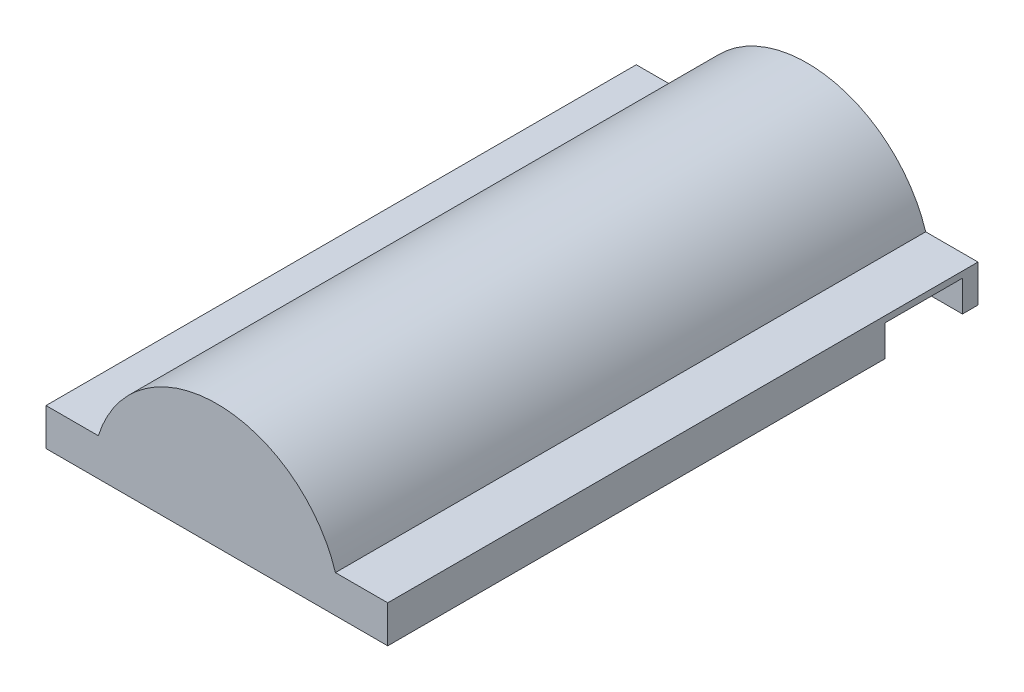
ISO-10303-21;
HEADER;
FILE_DESCRIPTION(('STEP AP214'),'2;1');
FILE_NAME('part.step','',(''),(''),'','','');
FILE_SCHEMA(('AUTOMOTIVE_DESIGN { 1 0 10303 214 1 1 1 1 }'));
ENDSEC;
DATA;
#1=APPLICATION_CONTEXT('core data for automotive mechanical design processes');
#2=APPLICATION_PROTOCOL_DEFINITION('international standard','automotive_design',2000,#1);
#3=PRODUCT_CONTEXT('',#1,'mechanical');
#4=PRODUCT('Part','Part','',(#3));
#5=PRODUCT_RELATED_PRODUCT_CATEGORY('part','',(#4));
#6=PRODUCT_DEFINITION_FORMATION('','',#4);
#7=PRODUCT_DEFINITION_CONTEXT('part definition',#1,'design');
#8=PRODUCT_DEFINITION('design','',#6,#7);
#9=PRODUCT_DEFINITION_SHAPE('','',#8);
#10=(LENGTH_UNIT() NAMED_UNIT(*) SI_UNIT(.MILLI.,.METRE.));
#11=(NAMED_UNIT(*) PLANE_ANGLE_UNIT() SI_UNIT($,.RADIAN.));
#12=(NAMED_UNIT(*) SI_UNIT($,.STERADIAN.) SOLID_ANGLE_UNIT());
#13=UNCERTAINTY_MEASURE_WITH_UNIT(LENGTH_MEASURE(1.E-05),#10,'distance_accuracy_value','');
#14=(GEOMETRIC_REPRESENTATION_CONTEXT(3) GLOBAL_UNCERTAINTY_ASSIGNED_CONTEXT((#13)) GLOBAL_UNIT_ASSIGNED_CONTEXT((#10,
#11,#12)) REPRESENTATION_CONTEXT('',''));
#15=CARTESIAN_POINT('',(0.,0.,0.));
#16=DIRECTION('',(0.,0.,1.));
#17=DIRECTION('',(1.,0.,0.));
#18=AXIS2_PLACEMENT_3D('',#15,#16,#17);
#19=CARTESIAN_POINT('',(550.,2.22044604925031E-13,0.));
#20=DIRECTION('',(0.,0.,1.));
#21=DIRECTION('',(1.,0.,0.));
#22=AXIS2_PLACEMENT_3D('',#19,#20,#21);
#23=CYLINDRICAL_SURFACE('',#22,300.);
#24=CARTESIAN_POINT('',(550.000000000001,-1.55431223447522E-12,1890.));
#25=DIRECTION('',(0.,0.,1.));
#26=DIRECTION('',(1.,0.,0.));
#27=AXIS2_PLACEMENT_3D('',#24,#25,#26);
#28=CIRCLE('',#27,300.);
#29=CARTESIAN_POINT('',(250.,-2.22044604925031E-13,1890.));
#30=VERTEX_POINT('',#29);
#31=CARTESIAN_POINT('',(850.000000000003,6.66133814775094E-13,1890.));
#32=VERTEX_POINT('',#31);
#33=EDGE_CURVE('E51',#30,#32,#28,.F.);
#34=ORIENTED_EDGE('',*,*,#33,.F.);
#35=DIRECTION('',(0.,0.,1.));
#36=VECTOR('',#35,1.);
#37=CARTESIAN_POINT('',(250.,1.55431223447522E-12,0.));
#38=LINE('',#37,#36);
#39=CARTESIAN_POINT('',(250.,-2.22044604925031E-13,1880.));
#40=VERTEX_POINT('',#39);
#41=EDGE_CURVE('E240',#40,#30,#38,.T.);
#42=ORIENTED_EDGE('',*,*,#41,.F.);
#43=CARTESIAN_POINT('',(550.,-2.22044604925031E-13,1880.));
#44=DIRECTION('',(0.,0.,1.));
#45=DIRECTION('',(1.,0.,0.));
#46=AXIS2_PLACEMENT_3D('',#43,#44,#45);
#47=CIRCLE('',#46,300.);
#48=CARTESIAN_POINT('',(850.000000000003,6.66133814775094E-13,1880.));
#49=VERTEX_POINT('',#48);
#50=EDGE_CURVE('E337',#49,#40,#47,.T.);
#51=ORIENTED_EDGE('',*,*,#50,.F.);
#52=DIRECTION('',(0.,0.,1.));
#53=VECTOR('',#52,1.);
#54=CARTESIAN_POINT('',(850.000000000003,4.44089209850063E-13,0.));
#55=LINE('',#54,#53);
#56=EDGE_CURVE('E56',#32,#49,#55,.F.);
#57=ORIENTED_EDGE('',*,*,#56,.F.);
#58=EDGE_LOOP('',(#34,#42,#51,#57));
#59=FACE_BOUND('',#58,.T.);
#60=ADVANCED_FACE('F36',(#59),#23,.F.);
#61=CARTESIAN_POINT('',(550.,2.22044604925031E-13,10.));
#62=DIRECTION('',(0.,0.,-1.));
#63=DIRECTION('',(-1.,0.,0.));
#64=AXIS2_PLACEMENT_3D('',#61,#62,#63);
#65=CIRCLE('',#64,300.);
#66=CARTESIAN_POINT('',(850.000000000003,4.44089209850063E-13,9.99999999999995));
#67=VERTEX_POINT('',#66);
#68=CARTESIAN_POINT('',(250.,1.55431223447522E-12,9.99999999999995));
#69=VERTEX_POINT('',#68);
#70=EDGE_CURVE('E210',#67,#69,#65,.F.);
#71=ORIENTED_EDGE('',*,*,#70,.F.);
#72=CARTESIAN_POINT('',(850.000000000003,4.44089209850063E-13,20.));
#73=VERTEX_POINT('',#72);
#74=EDGE_CURVE('E220',#73,#67,#55,.F.);
#75=ORIENTED_EDGE('',*,*,#74,.F.);
#76=CARTESIAN_POINT('',(550.,2.22044604925031E-13,20.));
#77=DIRECTION('',(0.,0.,1.));
#78=DIRECTION('',(1.,0.,0.));
#79=AXIS2_PLACEMENT_3D('',#76,#77,#78);
#80=CIRCLE('',#79,300.);
#81=CARTESIAN_POINT('',(250.000000000001,6.66133814775094E-13,20.));
#82=VERTEX_POINT('',#81);
#83=EDGE_CURVE('E339',#73,#82,#80,.T.);
#84=ORIENTED_EDGE('',*,*,#83,.T.);
#85=EDGE_CURVE('E221',#69,#82,#38,.T.);
#86=ORIENTED_EDGE('',*,*,#85,.F.);
#87=EDGE_LOOP('',(#71,#75,#84,#86));
#88=FACE_BOUND('',#87,.T.);
#89=ADVANCED_FACE('F218',(#88),#23,.F.);
#90=CARTESIAN_POINT('',(0.,-2.22044604925031E-13,1900.));
#91=DIRECTION('',(0.,1.,0.));
#92=DIRECTION('',(0.,0.,1.));
#93=AXIS2_PLACEMENT_3D('',#90,#91,#92);
#94=PLANE('',#93);
#95=DIRECTION('',(1.,0.,0.));
#96=VECTOR('',#95,1.);
#97=CARTESIAN_POINT('',(0.,-2.22044604925031E-13,320.));
#98=LINE('',#97,#96);
#99=CARTESIAN_POINT('',(850.000000000001,2.22044604925031E-13,320.));
#100=VERTEX_POINT('',#99);
#101=CARTESIAN_POINT('',(1080.,-8.88178419700125E-13,320.));
#102=VERTEX_POINT('',#101);
#103=EDGE_CURVE('E348',#100,#102,#98,.T.);
#104=ORIENTED_EDGE('',*,*,#103,.F.);
#105=CARTESIAN_POINT('',(850.000000000001,2.22044604925031E-13,300.));
#106=VERTEX_POINT('',#105);
#107=EDGE_CURVE('E231',#100,#106,#55,.F.);
#108=ORIENTED_EDGE('',*,*,#107,.T.);
#109=DIRECTION('',(1.,0.,0.));
#110=VECTOR('',#109,1.);
#111=CARTESIAN_POINT('',(550.000000000002,4.44089209850063E-13,300.));
#112=LINE('',#111,#110);
#113=CARTESIAN_POINT('',(1100.,4.44089209850063E-13,300.));
#114=VERTEX_POINT('',#113);
#115=EDGE_CURVE('E233',#106,#114,#112,.T.);
#116=ORIENTED_EDGE('',*,*,#115,.T.);
#117=DIRECTION('',(0.,0.,-1.));
#118=VECTOR('',#117,1.);
#119=CARTESIAN_POINT('',(1100.,-2.22044604925031E-13,1900.));
#120=LINE('',#119,#118);
#121=CARTESIAN_POINT('',(1100.,-2.22044604925031E-13,1900.));
#122=VERTEX_POINT('',#121);
#123=EDGE_CURVE('E286',#122,#114,#120,.T.);
#124=ORIENTED_EDGE('',*,*,#123,.F.);
#125=DIRECTION('',(1.,0.,0.));
#126=VECTOR('',#125,1.);
#127=CARTESIAN_POINT('',(0.,-2.22044604925031E-13,1900.));
#128=LINE('',#127,#126);
#129=CARTESIAN_POINT('',(0.,-2.22044604925031E-13,1900.));
#130=VERTEX_POINT('',#129);
#131=EDGE_CURVE('E251',#130,#122,#128,.T.);
#132=ORIENTED_EDGE('',*,*,#131,.F.);
#133=DIRECTION('',(0.,0.,-1.));
#134=VECTOR('',#133,1.);
#135=CARTESIAN_POINT('',(0.,-2.22044604925031E-13,1900.));
#136=LINE('',#135,#134);
#137=CARTESIAN_POINT('',(0.,0.,0.));
#138=VERTEX_POINT('',#137);
#139=EDGE_CURVE('E289',#130,#138,#136,.T.);
#140=ORIENTED_EDGE('',*,*,#139,.T.);
#141=DIRECTION('',(1.,0.,0.));
#142=VECTOR('',#141,1.);
#143=CARTESIAN_POINT('',(0.,0.,0.));
#144=LINE('',#143,#142);
#145=CARTESIAN_POINT('',(1100.,0.,0.));
#146=VERTEX_POINT('',#145);
#147=EDGE_CURVE('E265',#138,#146,#144,.T.);
#148=ORIENTED_EDGE('',*,*,#147,.T.);
#149=CARTESIAN_POINT('',(1100.,0.,50.));
#150=VERTEX_POINT('',#149);
#151=EDGE_CURVE('E285',#150,#146,#120,.T.);
#152=ORIENTED_EDGE('',*,*,#151,.F.);
#153=DIRECTION('',(1.,0.,0.));
#154=VECTOR('',#153,1.);
#155=CARTESIAN_POINT('',(550.,2.22044604925031E-13,50.));
#156=LINE('',#155,#154);
#157=CARTESIAN_POINT('',(850.000000000001,-2.22044604925031E-13,50.));
#158=VERTEX_POINT('',#157);
#159=EDGE_CURVE('E229',#158,#150,#156,.T.);
#160=ORIENTED_EDGE('',*,*,#159,.F.);
#161=CARTESIAN_POINT('',(850.000000000003,4.44089209850063E-13,30.));
#162=VERTEX_POINT('',#161);
#163=EDGE_CURVE('E228',#158,#162,#55,.F.);
#164=ORIENTED_EDGE('',*,*,#163,.T.);
#165=DIRECTION('',(1.,0.,0.));
#166=VECTOR('',#165,1.);
#167=CARTESIAN_POINT('',(550.,2.22044604925031E-13,30.));
#168=LINE('',#167,#166);
#169=CARTESIAN_POINT('',(1080.,-1.33226762955019E-12,30.));
#170=VERTEX_POINT('',#169);
#171=EDGE_CURVE('E340',#162,#170,#168,.T.);
#172=ORIENTED_EDGE('',*,*,#171,.T.);
#173=DIRECTION('',(0.,0.,-1.));
#174=VECTOR('',#173,1.);
#175=CARTESIAN_POINT('',(1080.,-4.44089209850063E-13,1900.));
#176=LINE('',#175,#174);
#177=CARTESIAN_POINT('',(1080.,-1.33226762955019E-12,20.));
#178=VERTEX_POINT('',#177);
#179=EDGE_CURVE('E347',#170,#178,#176,.T.);
#180=ORIENTED_EDGE('',*,*,#179,.T.);
#181=DIRECTION('',(1.,0.,0.));
#182=VECTOR('',#181,1.);
#183=CARTESIAN_POINT('',(0.,0.,20.));
#184=LINE('',#183,#182);
#185=EDGE_CURVE('E227',#73,#178,#184,.T.);
#186=ORIENTED_EDGE('',*,*,#185,.F.);
#187=ORIENTED_EDGE('',*,*,#74,.T.);
#188=DIRECTION('',(-1.,0.,0.));
#189=VECTOR('',#188,1.);
#190=CARTESIAN_POINT('',(0.,0.,10.));
#191=LINE('',#190,#189);
#192=EDGE_CURVE('E207',#67,#69,#191,.T.);
#193=ORIENTED_EDGE('',*,*,#192,.T.);
#194=ORIENTED_EDGE('',*,*,#85,.T.);
#195=DIRECTION('',(1.,0.,0.));
#196=VECTOR('',#195,1.);
#197=CARTESIAN_POINT('',(0.,0.,20.));
#198=LINE('',#197,#196);
#199=CARTESIAN_POINT('',(19.9999999999996,4.44089209850063E-13,20.));
#200=VERTEX_POINT('',#199);
#201=EDGE_CURVE('E364',#200,#82,#198,.T.);
#202=ORIENTED_EDGE('',*,*,#201,.F.);
#203=DIRECTION('',(0.,0.,-1.));
#204=VECTOR('',#203,1.);
#205=CARTESIAN_POINT('',(20.0000000000005,-4.44089209850063E-13,1900.));
#206=LINE('',#205,#204);
#207=CARTESIAN_POINT('',(20.0000000000005,-4.44089209850063E-13,1880.));
#208=VERTEX_POINT('',#207);
#209=EDGE_CURVE('E346',#208,#200,#206,.T.);
#210=ORIENTED_EDGE('',*,*,#209,.F.);
#211=DIRECTION('',(1.,0.,0.));
#212=VECTOR('',#211,1.);
#213=CARTESIAN_POINT('',(0.,-2.22044604925031E-13,1880.));
#214=LINE('',#213,#212);
#215=EDGE_CURVE('E333',#208,#40,#214,.T.);
#216=ORIENTED_EDGE('',*,*,#215,.T.);
#217=ORIENTED_EDGE('',*,*,#41,.T.);
#218=DIRECTION('',(-1.,0.,0.));
#219=VECTOR('',#218,1.);
#220=CARTESIAN_POINT('',(0.,-2.22044604925031E-13,1890.));
#221=LINE('',#220,#219);
#222=EDGE_CURVE('E414',#32,#30,#221,.T.);
#223=ORIENTED_EDGE('',*,*,#222,.F.);
#224=ORIENTED_EDGE('',*,*,#56,.T.);
#225=DIRECTION('',(1.,0.,0.));
#226=VECTOR('',#225,1.);
#227=CARTESIAN_POINT('',(0.,-2.22044604925031E-13,1880.));
#228=LINE('',#227,#226);
#229=CARTESIAN_POINT('',(1080.,0.,1880.));
#230=VERTEX_POINT('',#229);
#231=EDGE_CURVE('E336',#49,#230,#228,.T.);
#232=ORIENTED_EDGE('',*,*,#231,.T.);
#233=DIRECTION('',(0.,0.,-1.));
#234=VECTOR('',#233,1.);
#235=CARTESIAN_POINT('',(1080.,-4.44089209850063E-13,1900.));
#236=LINE('',#235,#234);
#237=EDGE_CURVE('E343',#230,#102,#236,.T.);
#238=ORIENTED_EDGE('',*,*,#237,.T.);
#239=EDGE_LOOP('',(#104,#108,#116,#124,#132,#140,#148,#152,#160,#164,#172,#180,#186,#187,#193,
#194,#202,#210,#216,#217,#223,#224,#232,#238));
#240=FACE_BOUND('',#239,.T.);
#241=ADVANCED_FACE('F225',(#240),#94,.F.);
#242=CARTESIAN_POINT('',(550.,2.22044604925031E-13,30.));
#243=DIRECTION('',(0.,0.,-1.));
#244=DIRECTION('',(0.,1.,0.));
#245=AXIS2_PLACEMENT_3D('',#242,#243,#244);
#246=CIRCLE('',#245,300.);
#247=CARTESIAN_POINT('',(824.95454169735,120.,30.));
#248=VERTEX_POINT('',#247);
#249=EDGE_CURVE('E332',#162,#248,#246,.F.);
#250=ORIENTED_EDGE('',*,*,#249,.F.);
#251=ORIENTED_EDGE('',*,*,#163,.F.);
#252=CARTESIAN_POINT('',(550.,2.22044604925031E-13,50.));
#253=DIRECTION('',(0.,0.,-1.));
#254=DIRECTION('',(0.,1.,0.));
#255=AXIS2_PLACEMENT_3D('',#252,#253,#254);
#256=CIRCLE('',#255,300.);
#257=CARTESIAN_POINT('',(832.842712474619,100.,50.));
#258=VERTEX_POINT('',#257);
#259=EDGE_CURVE('E11',#158,#258,#256,.F.);
#260=ORIENTED_EDGE('',*,*,#259,.T.);
#261=DIRECTION('',(0.,0.,1.));
#262=VECTOR('',#261,1.);
#263=CARTESIAN_POINT('',(832.842712474619,100.,0.));
#264=LINE('',#263,#262);
#265=CARTESIAN_POINT('',(832.842712474619,100.,300.));
#266=VERTEX_POINT('',#265);
#267=EDGE_CURVE('E292',#258,#266,#264,.T.);
#268=ORIENTED_EDGE('',*,*,#267,.T.);
#269=CARTESIAN_POINT('',(550.000000000002,4.44089209850063E-13,300.));
#270=DIRECTION('',(0.,0.,1.));
#271=DIRECTION('',(1.,0.,0.));
#272=AXIS2_PLACEMENT_3D('',#269,#270,#271);
#273=CIRCLE('',#272,300.);
#274=EDGE_CURVE('E44',#266,#106,#273,.F.);
#275=ORIENTED_EDGE('',*,*,#274,.T.);
#276=ORIENTED_EDGE('',*,*,#107,.F.);
#277=CARTESIAN_POINT('',(550.000000000002,4.44089209850063E-13,320.));
#278=DIRECTION('',(0.,0.,1.));
#279=DIRECTION('',(1.,0.,0.));
#280=AXIS2_PLACEMENT_3D('',#277,#278,#279);
#281=CIRCLE('',#280,300.);
#282=CARTESIAN_POINT('',(824.954541697351,120.,320.));
#283=VERTEX_POINT('',#282);
#284=EDGE_CURVE('E352',#283,#100,#281,.F.);
#285=ORIENTED_EDGE('',*,*,#284,.F.);
#286=DIRECTION('',(0.,0.,1.));
#287=VECTOR('',#286,1.);
#288=CARTESIAN_POINT('',(824.95454169735,120.,30.));
#289=LINE('',#288,#287);
#290=EDGE_CURVE('E354',#248,#283,#289,.T.);
#291=ORIENTED_EDGE('',*,*,#290,.F.);
#292=EDGE_LOOP('',(#250,#251,#260,#268,#275,#276,#285,#291));
#293=FACE_BOUND('',#292,.T.);
#294=ADVANCED_FACE('F298',(#293),#23,.F.);
#295=CARTESIAN_POINT('',(0.,-2.22044604925031E-13,1900.));
#296=DIRECTION('',(1.,0.,0.));
#297=DIRECTION('',(0.,0.,-1.));
#298=AXIS2_PLACEMENT_3D('',#295,#296,#297);
#299=PLANE('',#298);
#300=DIRECTION('',(0.,-1.,0.));
#301=VECTOR('',#300,1.);
#302=CARTESIAN_POINT('',(0.,0.,0.));
#303=LINE('',#302,#301);
#304=CARTESIAN_POINT('',(0.,119.999999999999,0.));
#305=VERTEX_POINT('',#304);
#306=EDGE_CURVE('E246',#305,#138,#303,.T.);
#307=ORIENTED_EDGE('',*,*,#306,.T.);
#308=ORIENTED_EDGE('',*,*,#139,.F.);
#309=DIRECTION('',(0.,-1.,0.));
#310=VECTOR('',#309,1.);
#311=CARTESIAN_POINT('',(0.,-2.22044604925031E-13,1900.));
#312=LINE('',#311,#310);
#313=CARTESIAN_POINT('',(4.44089209850063E-13,119.999999999999,1900.));
#314=VERTEX_POINT('',#313);
#315=EDGE_CURVE('E248',#314,#130,#312,.T.);
#316=ORIENTED_EDGE('',*,*,#315,.F.);
#317=DIRECTION('',(0.,0.,-1.));
#318=VECTOR('',#317,1.);
#319=CARTESIAN_POINT('',(4.44089209850063E-13,119.999999999999,1900.));
#320=LINE('',#319,#318);
#321=EDGE_CURVE('E262',#314,#305,#320,.T.);
#322=ORIENTED_EDGE('',*,*,#321,.T.);
#323=EDGE_LOOP('',(#307,#308,#316,#322));
#324=FACE_BOUND('',#323,.T.);
#325=ADVANCED_FACE('F38',(#324),#299,.F.);
#326=CARTESIAN_POINT('',(1100.,-2.22044604925031E-13,1900.));
#327=DIRECTION('',(-1.,0.,0.));
#328=DIRECTION('',(0.,0.,1.));
#329=AXIS2_PLACEMENT_3D('',#326,#327,#328);
#330=PLANE('',#329);
#331=DIRECTION('',(0.,0.,1.));
#332=VECTOR('',#331,1.);
#333=CARTESIAN_POINT('',(1100.,100.000000000001,49.9999999999998));
#334=LINE('',#333,#332);
#335=CARTESIAN_POINT('',(1100.,100.000000000001,49.9999999999998));
#336=VERTEX_POINT('',#335);
#337=CARTESIAN_POINT('',(1100.,100.,300.));
#338=VERTEX_POINT('',#337);
#339=EDGE_CURVE('E314',#336,#338,#334,.T.);
#340=ORIENTED_EDGE('',*,*,#339,.F.);
#341=DIRECTION('',(0.,1.,0.));
#342=VECTOR('',#341,1.);
#343=CARTESIAN_POINT('',(1100.,0.,50.));
#344=LINE('',#343,#342);
#345=EDGE_CURVE('E315',#150,#336,#344,.T.);
#346=ORIENTED_EDGE('',*,*,#345,.F.);
#347=ORIENTED_EDGE('',*,*,#151,.T.);
#348=DIRECTION('',(0.,1.,0.));
#349=VECTOR('',#348,1.);
#350=CARTESIAN_POINT('',(1100.,0.,0.));
#351=LINE('',#350,#349);
#352=CARTESIAN_POINT('',(1100.,120.,0.));
#353=VERTEX_POINT('',#352);
#354=EDGE_CURVE('E267',#146,#353,#351,.T.);
#355=ORIENTED_EDGE('',*,*,#354,.T.);
#356=DIRECTION('',(0.,0.,-1.));
#357=VECTOR('',#356,1.);
#358=CARTESIAN_POINT('',(1100.,120.,1900.));
#359=LINE('',#358,#357);
#360=CARTESIAN_POINT('',(1100.,120.,1900.));
#361=VERTEX_POINT('',#360);
#362=EDGE_CURVE('E282',#361,#353,#359,.T.);
#363=ORIENTED_EDGE('',*,*,#362,.F.);
#364=DIRECTION('',(0.,1.,0.));
#365=VECTOR('',#364,1.);
#366=CARTESIAN_POINT('',(1100.,-2.22044604925031E-13,1900.));
#367=LINE('',#366,#365);
#368=EDGE_CURVE('E254',#122,#361,#367,.T.);
#369=ORIENTED_EDGE('',*,*,#368,.F.);
#370=ORIENTED_EDGE('',*,*,#123,.T.);
#371=DIRECTION('',(0.,-1.,0.));
#372=VECTOR('',#371,1.);
#373=CARTESIAN_POINT('',(1100.,4.44089209850063E-13,300.));
#374=LINE('',#373,#372);
#375=EDGE_CURVE('E305',#338,#114,#374,.T.);
#376=ORIENTED_EDGE('',*,*,#375,.F.);
#377=EDGE_LOOP('',(#340,#346,#347,#355,#363,#369,#370,#376));
#378=FACE_BOUND('',#377,.T.);
#379=ADVANCED_FACE('F436',(#378),#330,.F.);
#380=CARTESIAN_POINT('',(931.575680566778,120.,1900.));
#381=DIRECTION('',(0.,-1.,0.));
#382=DIRECTION('',(0.,0.,-1.));
#383=AXIS2_PLACEMENT_3D('',#380,#381,#382);
#384=PLANE('',#383);
#385=DIRECTION('',(-1.,0.,0.));
#386=VECTOR('',#385,1.);
#387=CARTESIAN_POINT('',(931.575680566779,120.000000000001,0.));
#388=LINE('',#387,#386);
#389=CARTESIAN_POINT('',(931.575680566779,120.000000000001,0.));
#390=VERTEX_POINT('',#389);
#391=EDGE_CURVE('E269',#353,#390,#388,.T.);
#392=ORIENTED_EDGE('',*,*,#391,.T.);
#393=DIRECTION('',(0.,0.,-1.));
#394=VECTOR('',#393,1.);
#395=CARTESIAN_POINT('',(931.575680566778,120.,1900.));
#396=LINE('',#395,#394);
#397=CARTESIAN_POINT('',(931.575680566778,120.,1900.));
#398=VERTEX_POINT('',#397);
#399=EDGE_CURVE('E279',#398,#390,#396,.T.);
#400=ORIENTED_EDGE('',*,*,#399,.F.);
#401=DIRECTION('',(-1.,0.,0.));
#402=VECTOR('',#401,1.);
#403=CARTESIAN_POINT('',(931.575680566778,120.,1900.));
#404=LINE('',#403,#402);
#405=EDGE_CURVE('E256',#361,#398,#404,.T.);
#406=ORIENTED_EDGE('',*,*,#405,.F.);
#407=ORIENTED_EDGE('',*,*,#362,.T.);
#408=EDGE_LOOP('',(#392,#400,#406,#407));
#409=FACE_BOUND('',#408,.T.);
#410=ADVANCED_FACE('F443',(#409),#384,.F.);
#411=CARTESIAN_POINT('',(550.000000000001,-1.55431223447522E-12,1900.));
#412=DIRECTION('',(0.,0.,-1.));
#413=DIRECTION('',(-1.,0.,0.));
#414=AXIS2_PLACEMENT_3D('',#411,#412,#413);
#415=CYLINDRICAL_SURFACE('',#414,400.);
#416=CARTESIAN_POINT('',(550.,2.22044604925031E-13,0.));
#417=DIRECTION('',(0.,0.,1.));
#418=DIRECTION('',(1.,0.,0.));
#419=AXIS2_PLACEMENT_3D('',#416,#417,#418);
#420=CIRCLE('',#419,400.);
#421=CARTESIAN_POINT('',(168.424319433222,120.,0.));
#422=VERTEX_POINT('',#421);
#423=EDGE_CURVE('E271',#390,#422,#420,.T.);
#424=ORIENTED_EDGE('',*,*,#423,.T.);
#425=DIRECTION('',(0.,0.,-1.));
#426=VECTOR('',#425,1.);
#427=CARTESIAN_POINT('',(168.424319433222,119.999999999998,1900.));
#428=LINE('',#427,#426);
#429=CARTESIAN_POINT('',(168.424319433222,119.999999999998,1900.));
#430=VERTEX_POINT('',#429);
#431=EDGE_CURVE('E276',#430,#422,#428,.T.);
#432=ORIENTED_EDGE('',*,*,#431,.F.);
#433=CARTESIAN_POINT('',(550.000000000001,-1.55431223447522E-12,1900.));
#434=DIRECTION('',(0.,0.,1.));
#435=DIRECTION('',(1.,0.,0.));
#436=AXIS2_PLACEMENT_3D('',#433,#434,#435);
#437=CIRCLE('',#436,400.);
#438=EDGE_CURVE('E258',#398,#430,#437,.T.);
#439=ORIENTED_EDGE('',*,*,#438,.F.);
#440=ORIENTED_EDGE('',*,*,#399,.T.);
#441=EDGE_LOOP('',(#424,#432,#439,#440));
#442=FACE_BOUND('',#441,.T.);
#443=ADVANCED_FACE('F447',(#442),#415,.T.);
#444=CARTESIAN_POINT('',(4.44089209850063E-13,119.999999999999,1900.));
#445=DIRECTION('',(0.,-1.,0.));
#446=DIRECTION('',(0.,0.,-1.));
#447=AXIS2_PLACEMENT_3D('',#444,#445,#446);
#448=PLANE('',#447);
#449=DIRECTION('',(-1.,0.,0.));
#450=VECTOR('',#449,1.);
#451=CARTESIAN_POINT('',(0.,119.999999999999,0.));
#452=LINE('',#451,#450);
#453=EDGE_CURVE('E252',#422,#305,#452,.T.);
#454=ORIENTED_EDGE('',*,*,#453,.T.);
#455=ORIENTED_EDGE('',*,*,#321,.F.);
#456=DIRECTION('',(-1.,0.,0.));
#457=VECTOR('',#456,1.);
#458=CARTESIAN_POINT('',(4.44089209850063E-13,119.999999999999,1900.));
#459=LINE('',#458,#457);
#460=EDGE_CURVE('E260',#430,#314,#459,.T.);
#461=ORIENTED_EDGE('',*,*,#460,.F.);
#462=ORIENTED_EDGE('',*,*,#431,.T.);
#463=EDGE_LOOP('',(#454,#455,#461,#462));
#464=FACE_BOUND('',#463,.T.);
#465=ADVANCED_FACE('F451',(#464),#448,.F.);
#466=CARTESIAN_POINT('',(550.000000000001,-1.55431223447522E-12,1900.));
#467=DIRECTION('',(0.,0.,1.));
#468=DIRECTION('',(1.,0.,0.));
#469=AXIS2_PLACEMENT_3D('',#466,#467,#468);
#470=PLANE('',#469);
#471=ORIENTED_EDGE('',*,*,#131,.T.);
#472=ORIENTED_EDGE('',*,*,#368,.T.);
#473=ORIENTED_EDGE('',*,*,#405,.T.);
#474=ORIENTED_EDGE('',*,*,#438,.T.);
#475=ORIENTED_EDGE('',*,*,#460,.T.);
#476=ORIENTED_EDGE('',*,*,#315,.T.);
#477=EDGE_LOOP('',(#471,#472,#473,#474,#475,#476));
#478=FACE_BOUND('',#477,.T.);
#479=ADVANCED_FACE('F455',(#478),#470,.T.);
#480=CARTESIAN_POINT('',(550.,2.22044604925031E-13,0.));
#481=DIRECTION('',(0.,0.,1.));
#482=DIRECTION('',(1.,0.,0.));
#483=AXIS2_PLACEMENT_3D('',#480,#481,#482);
#484=PLANE('',#483);
#485=ORIENTED_EDGE('',*,*,#354,.F.);
#486=ORIENTED_EDGE('',*,*,#147,.F.);
#487=ORIENTED_EDGE('',*,*,#306,.F.);
#488=ORIENTED_EDGE('',*,*,#453,.F.);
#489=ORIENTED_EDGE('',*,*,#423,.F.);
#490=ORIENTED_EDGE('',*,*,#391,.F.);
#491=EDGE_LOOP('',(#485,#486,#487,#488,#489,#490));
#492=FACE_BOUND('',#491,.T.);
#493=ADVANCED_FACE('F457',(#492),#484,.F.);
#494=CARTESIAN_POINT('',(550.,2.22044604925031E-13,50.));
#495=DIRECTION('',(0.,0.,-1.));
#496=DIRECTION('',(0.,1.,0.));
#497=AXIS2_PLACEMENT_3D('',#494,#495,#496);
#498=PLANE('',#497);
#499=ORIENTED_EDGE('',*,*,#159,.T.);
#500=ORIENTED_EDGE('',*,*,#345,.T.);
#501=DIRECTION('',(1.,0.,0.));
#502=VECTOR('',#501,1.);
#503=CARTESIAN_POINT('',(550.000000000001,100.,50.));
#504=LINE('',#503,#502);
#505=EDGE_CURVE('E308',#258,#336,#504,.T.);
#506=ORIENTED_EDGE('',*,*,#505,.F.);
#507=ORIENTED_EDGE('',*,*,#259,.F.);
#508=EDGE_LOOP('',(#499,#500,#506,#507));
#509=FACE_BOUND('',#508,.T.);
#510=ADVANCED_FACE('F459',(#509),#498,.F.);
#511=CARTESIAN_POINT('',(550.000000000002,4.44089209850063E-13,300.));
#512=DIRECTION('',(0.,0.,1.));
#513=DIRECTION('',(1.,0.,0.));
#514=AXIS2_PLACEMENT_3D('',#511,#512,#513);
#515=PLANE('',#514);
#516=DIRECTION('',(1.,0.,0.));
#517=VECTOR('',#516,1.);
#518=CARTESIAN_POINT('',(550.,100.,300.));
#519=LINE('',#518,#517);
#520=EDGE_CURVE('E302',#266,#338,#519,.T.);
#521=ORIENTED_EDGE('',*,*,#520,.T.);
#522=ORIENTED_EDGE('',*,*,#375,.T.);
#523=ORIENTED_EDGE('',*,*,#115,.F.);
#524=ORIENTED_EDGE('',*,*,#274,.F.);
#525=EDGE_LOOP('',(#521,#522,#523,#524));
#526=FACE_BOUND('',#525,.T.);
#527=ADVANCED_FACE('F301',(#526),#515,.F.);
#528=CARTESIAN_POINT('',(550.000000000001,100.,50.));
#529=DIRECTION('',(0.,1.,0.));
#530=DIRECTION('',(0.,0.,1.));
#531=AXIS2_PLACEMENT_3D('',#528,#529,#530);
#532=PLANE('',#531);
#533=ORIENTED_EDGE('',*,*,#505,.T.);
#534=ORIENTED_EDGE('',*,*,#339,.T.);
#535=ORIENTED_EDGE('',*,*,#520,.F.);
#536=ORIENTED_EDGE('',*,*,#267,.F.);
#537=EDGE_LOOP('',(#533,#534,#535,#536));
#538=FACE_BOUND('',#537,.T.);
#539=ADVANCED_FACE('F559',(#538),#532,.F.);
#540=CARTESIAN_POINT('',(550.,120.,50.));
#541=DIRECTION('',(0.,1.,0.));
#542=DIRECTION('',(0.,0.,1.));
#543=AXIS2_PLACEMENT_3D('',#540,#541,#542);
#544=PLANE('',#543);
#545=DIRECTION('',(0.,0.,-1.));
#546=VECTOR('',#545,1.);
#547=CARTESIAN_POINT('',(910.5551275464,120.,1900.));
#548=LINE('',#547,#546);
#549=CARTESIAN_POINT('',(910.555127546399,120.,320.));
#550=VERTEX_POINT('',#549);
#551=CARTESIAN_POINT('',(910.5551275464,120.,30.));
#552=VERTEX_POINT('',#551);
#553=EDGE_CURVE('E319',#550,#552,#548,.T.);
#554=ORIENTED_EDGE('',*,*,#553,.T.);
#555=DIRECTION('',(1.,0.,0.));
#556=VECTOR('',#555,1.);
#557=CARTESIAN_POINT('',(550.,120.,30.));
#558=LINE('',#557,#556);
#559=EDGE_CURVE('E373',#248,#552,#558,.T.);
#560=ORIENTED_EDGE('',*,*,#559,.F.);
#561=ORIENTED_EDGE('',*,*,#290,.T.);
#562=DIRECTION('',(1.,0.,0.));
#563=VECTOR('',#562,1.);
#564=CARTESIAN_POINT('',(550.000000000001,120.,320.));
#565=LINE('',#564,#563);
#566=EDGE_CURVE('E351',#283,#550,#565,.T.);
#567=ORIENTED_EDGE('',*,*,#566,.T.);
#568=EDGE_LOOP('',(#554,#560,#561,#567));
#569=FACE_BOUND('',#568,.T.);
#570=ADVANCED_FACE('F519',(#569),#544,.T.);
#571=CARTESIAN_POINT('',(550.000000000002,4.44089209850063E-13,320.));
#572=DIRECTION('',(0.,0.,1.));
#573=DIRECTION('',(1.,0.,0.));
#574=AXIS2_PLACEMENT_3D('',#571,#572,#573);
#575=PLANE('',#574);
#576=CARTESIAN_POINT('',(550.000000000002,4.44089209850063E-13,320.));
#577=DIRECTION('',(0.,0.,1.));
#578=DIRECTION('',(1.,0.,0.));
#579=AXIS2_PLACEMENT_3D('',#576,#577,#578);
#580=CIRCLE('',#579,380.);
#581=CARTESIAN_POINT('',(916.60605559647,100.000000000001,320.000000000001));
#582=VERTEX_POINT('',#581);
#583=EDGE_CURVE('E322',#582,#550,#580,.T.);
#584=ORIENTED_EDGE('',*,*,#583,.T.);
#585=ORIENTED_EDGE('',*,*,#566,.F.);
#586=ORIENTED_EDGE('',*,*,#284,.T.);
#587=ORIENTED_EDGE('',*,*,#103,.T.);
#588=DIRECTION('',(0.,-1.,0.));
#589=VECTOR('',#588,1.);
#590=CARTESIAN_POINT('',(1080.,-8.88178419700125E-13,320.));
#591=LINE('',#590,#589);
#592=CARTESIAN_POINT('',(1080.,100.,320.));
#593=VERTEX_POINT('',#592);
#594=EDGE_CURVE('E376',#593,#102,#591,.T.);
#595=ORIENTED_EDGE('',*,*,#594,.F.);
#596=DIRECTION('',(-1.,0.,0.));
#597=VECTOR('',#596,1.);
#598=CARTESIAN_POINT('',(931.575680566778,100.,320.));
#599=LINE('',#598,#597);
#600=EDGE_CURVE('E326',#593,#582,#599,.T.);
#601=ORIENTED_EDGE('',*,*,#600,.T.);
#602=EDGE_LOOP('',(#584,#585,#586,#587,#595,#601));
#603=FACE_BOUND('',#602,.T.);
#604=ADVANCED_FACE('F516',(#603),#575,.T.);
#605=CARTESIAN_POINT('',(931.575680566781,99.9999999999992,1900.));
#606=DIRECTION('',(0.,-1.,0.));
#607=DIRECTION('',(0.,0.,-1.));
#608=AXIS2_PLACEMENT_3D('',#605,#606,#607);
#609=PLANE('',#608);
#610=DIRECTION('',(0.,0.,-1.));
#611=VECTOR('',#610,1.);
#612=CARTESIAN_POINT('',(1080.,99.9999999999999,1900.));
#613=LINE('',#612,#611);
#614=CARTESIAN_POINT('',(1080.,99.9999999999999,1880.));
#615=VERTEX_POINT('',#614);
#616=EDGE_CURVE('E387',#615,#593,#613,.T.);
#617=ORIENTED_EDGE('',*,*,#616,.F.);
#618=DIRECTION('',(-1.,0.,0.));
#619=VECTOR('',#618,1.);
#620=CARTESIAN_POINT('',(931.575680566781,99.9999999999992,1880.));
#621=LINE('',#620,#619);
#622=CARTESIAN_POINT('',(916.606055596468,100.,1880.));
#623=VERTEX_POINT('',#622);
#624=EDGE_CURVE('E380',#615,#623,#621,.T.);
#625=ORIENTED_EDGE('',*,*,#624,.T.);
#626=DIRECTION('',(0.,0.,-1.));
#627=VECTOR('',#626,1.);
#628=CARTESIAN_POINT('',(916.606055596468,100.,1880.));
#629=LINE('',#628,#627);
#630=EDGE_CURVE('E393',#623,#582,#629,.T.);
#631=ORIENTED_EDGE('',*,*,#630,.T.);
#632=ORIENTED_EDGE('',*,*,#600,.F.);
#633=EDGE_LOOP('',(#617,#625,#631,#632));
#634=FACE_BOUND('',#633,.T.);
#635=ADVANCED_FACE('F528',(#634),#609,.T.);
#636=CARTESIAN_POINT('',(1080.,-4.44089209850063E-13,1900.));
#637=DIRECTION('',(-1.,0.,0.));
#638=DIRECTION('',(0.,0.,1.));
#639=AXIS2_PLACEMENT_3D('',#636,#637,#638);
#640=PLANE('',#639);
#641=CARTESIAN_POINT('',(1080.,100.,30.));
#642=VERTEX_POINT('',#641);
#643=CARTESIAN_POINT('',(1080.,100.,20.));
#644=VERTEX_POINT('',#643);
#645=EDGE_CURVE('E362',#642,#644,#613,.T.);
#646=ORIENTED_EDGE('',*,*,#645,.T.);
#647=DIRECTION('',(0.,1.,0.));
#648=VECTOR('',#647,1.);
#649=CARTESIAN_POINT('',(1080.,-1.33226762955019E-12,20.));
#650=LINE('',#649,#648);
#651=EDGE_CURVE('E369',#178,#644,#650,.T.);
#652=ORIENTED_EDGE('',*,*,#651,.F.);
#653=ORIENTED_EDGE('',*,*,#179,.F.);
#654=DIRECTION('',(0.,1.,0.));
#655=VECTOR('',#654,1.);
#656=CARTESIAN_POINT('',(1080.,-1.33226762955019E-12,30.));
#657=LINE('',#656,#655);
#658=EDGE_CURVE('E214',#170,#642,#657,.T.);
#659=ORIENTED_EDGE('',*,*,#658,.T.);
#660=EDGE_LOOP('',(#646,#652,#653,#659));
#661=FACE_BOUND('',#660,.T.);
#662=ADVANCED_FACE('F492',(#661),#640,.T.);
#663=CARTESIAN_POINT('',(20.0000000000005,-4.44089209850063E-13,1900.));
#664=DIRECTION('',(1.,0.,0.));
#665=DIRECTION('',(0.,0.,-1.));
#666=AXIS2_PLACEMENT_3D('',#663,#664,#665);
#667=PLANE('',#666);
#668=DIRECTION('',(0.,-1.,0.));
#669=VECTOR('',#668,1.);
#670=CARTESIAN_POINT('',(19.9999999999996,4.44089209850063E-13,20.));
#671=LINE('',#670,#669);
#672=CARTESIAN_POINT('',(20.0000000000005,99.9999999999999,19.9999999999998));
#673=VERTEX_POINT('',#672);
#674=EDGE_CURVE('E365',#673,#200,#671,.T.);
#675=ORIENTED_EDGE('',*,*,#674,.F.);
#676=DIRECTION('',(0.,0.,-1.));
#677=VECTOR('',#676,1.);
#678=CARTESIAN_POINT('',(20.0000000000005,99.9999999999981,1900.));
#679=LINE('',#678,#677);
#680=CARTESIAN_POINT('',(20.0000000000005,99.9999999999985,1880.));
#681=VERTEX_POINT('',#680);
#682=EDGE_CURVE('E404',#681,#673,#679,.T.);
#683=ORIENTED_EDGE('',*,*,#682,.F.);
#684=DIRECTION('',(0.,-1.,0.));
#685=VECTOR('',#684,1.);
#686=CARTESIAN_POINT('',(20.0000000000005,-4.44089209850063E-13,1880.));
#687=LINE('',#686,#685);
#688=EDGE_CURVE('E342',#681,#208,#687,.T.);
#689=ORIENTED_EDGE('',*,*,#688,.T.);
#690=ORIENTED_EDGE('',*,*,#209,.T.);
#691=EDGE_LOOP('',(#675,#683,#689,#690));
#692=FACE_BOUND('',#691,.T.);
#693=ADVANCED_FACE('F502',(#692),#667,.T.);
#694=ORIENTED_EDGE('',*,*,#594,.T.);
#695=ORIENTED_EDGE('',*,*,#237,.F.);
#696=DIRECTION('',(0.,1.,0.));
#697=VECTOR('',#696,1.);
#698=CARTESIAN_POINT('',(1080.,0.,1880.));
#699=LINE('',#698,#697);
#700=EDGE_CURVE('E335',#230,#615,#699,.T.);
#701=ORIENTED_EDGE('',*,*,#700,.T.);
#702=ORIENTED_EDGE('',*,*,#616,.T.);
#703=EDGE_LOOP('',(#694,#695,#701,#702));
#704=FACE_BOUND('',#703,.T.);
#705=ADVANCED_FACE('F512',(#704),#640,.T.);
#706=DIRECTION('',(-1.,0.,0.));
#707=VECTOR('',#706,1.);
#708=CARTESIAN_POINT('',(550.000000000001,100.,30.));
#709=LINE('',#708,#707);
#710=CARTESIAN_POINT('',(916.606055596468,100.,30.));
#711=VERTEX_POINT('',#710);
#712=EDGE_CURVE('E329',#642,#711,#709,.T.);
#713=ORIENTED_EDGE('',*,*,#712,.T.);
#714=CARTESIAN_POINT('',(916.606055596468,100.,20.));
#715=VERTEX_POINT('',#714);
#716=EDGE_CURVE('E396',#711,#715,#629,.T.);
#717=ORIENTED_EDGE('',*,*,#716,.T.);
#718=DIRECTION('',(-1.,0.,0.));
#719=VECTOR('',#718,1.);
#720=CARTESIAN_POINT('',(931.575680566778,100.,19.9999999999998));
#721=LINE('',#720,#719);
#722=EDGE_CURVE('E382',#644,#715,#721,.T.);
#723=ORIENTED_EDGE('',*,*,#722,.F.);
#724=ORIENTED_EDGE('',*,*,#645,.F.);
#725=EDGE_LOOP('',(#713,#717,#723,#724));
#726=FACE_BOUND('',#725,.T.);
#727=ADVANCED_FACE('F525',(#726),#609,.T.);
#728=CARTESIAN_POINT('',(550.000000000001,-1.55431223447522E-12,1900.));
#729=DIRECTION('',(0.,0.,-1.));
#730=DIRECTION('',(-1.,0.,0.));
#731=AXIS2_PLACEMENT_3D('',#728,#729,#730);
#732=CYLINDRICAL_SURFACE('',#731,380.);
#733=ORIENTED_EDGE('',*,*,#583,.F.);
#734=ORIENTED_EDGE('',*,*,#630,.F.);
#735=CARTESIAN_POINT('',(550.,-2.22044604925031E-13,1880.));
#736=DIRECTION('',(0.,0.,1.));
#737=DIRECTION('',(1.,0.,0.));
#738=AXIS2_PLACEMENT_3D('',#735,#736,#737);
#739=CIRCLE('',#738,380.);
#740=CARTESIAN_POINT('',(183.393944403533,99.9999999999999,1880.));
#741=VERTEX_POINT('',#740);
#742=EDGE_CURVE('E389',#623,#741,#739,.T.);
#743=ORIENTED_EDGE('',*,*,#742,.T.);
#744=DIRECTION('',(0.,0.,-1.));
#745=VECTOR('',#744,1.);
#746=CARTESIAN_POINT('',(183.393944403533,99.9999999999999,1880.));
#747=LINE('',#746,#745);
#748=CARTESIAN_POINT('',(183.393944403533,99.9999999999985,20.));
#749=VERTEX_POINT('',#748);
#750=EDGE_CURVE('E401',#741,#749,#747,.T.);
#751=ORIENTED_EDGE('',*,*,#750,.T.);
#752=CARTESIAN_POINT('',(550.,2.22044604925031E-13,20.));
#753=DIRECTION('',(0.,0.,1.));
#754=DIRECTION('',(1.,0.,0.));
#755=AXIS2_PLACEMENT_3D('',#752,#753,#754);
#756=CIRCLE('',#755,380.);
#757=EDGE_CURVE('E392',#715,#749,#756,.T.);
#758=ORIENTED_EDGE('',*,*,#757,.F.);
#759=ORIENTED_EDGE('',*,*,#716,.F.);
#760=CARTESIAN_POINT('',(550.,2.22044604925031E-13,30.));
#761=DIRECTION('',(0.,0.,-1.));
#762=DIRECTION('',(0.,1.,0.));
#763=AXIS2_PLACEMENT_3D('',#760,#761,#762);
#764=CIRCLE('',#763,380.);
#765=EDGE_CURVE('E324',#711,#552,#764,.F.);
#766=ORIENTED_EDGE('',*,*,#765,.T.);
#767=ORIENTED_EDGE('',*,*,#553,.F.);
#768=EDGE_LOOP('',(#733,#734,#743,#751,#758,#759,#766,#767));
#769=FACE_BOUND('',#768,.T.);
#770=ADVANCED_FACE('F521',(#769),#732,.F.);
#771=CARTESIAN_POINT('',(-8.88178419700125E-13,99.9999999999985,1900.));
#772=DIRECTION('',(0.,-1.,0.));
#773=DIRECTION('',(0.,0.,-1.));
#774=AXIS2_PLACEMENT_3D('',#771,#772,#773);
#775=PLANE('',#774);
#776=DIRECTION('',(-1.,0.,0.));
#777=VECTOR('',#776,1.);
#778=CARTESIAN_POINT('',(0.,99.9999999999992,19.9999999999998));
#779=LINE('',#778,#777);
#780=EDGE_CURVE('E400',#749,#673,#779,.T.);
#781=ORIENTED_EDGE('',*,*,#780,.F.);
#782=ORIENTED_EDGE('',*,*,#750,.F.);
#783=DIRECTION('',(-1.,0.,0.));
#784=VECTOR('',#783,1.);
#785=CARTESIAN_POINT('',(0.,99.9999999999985,1880.));
#786=LINE('',#785,#784);
#787=EDGE_CURVE('E398',#741,#681,#786,.T.);
#788=ORIENTED_EDGE('',*,*,#787,.T.);
#789=ORIENTED_EDGE('',*,*,#682,.T.);
#790=EDGE_LOOP('',(#781,#782,#788,#789));
#791=FACE_BOUND('',#790,.T.);
#792=ADVANCED_FACE('F533',(#791),#775,.T.);
#793=CARTESIAN_POINT('',(550.,-2.22044604925031E-13,1880.));
#794=DIRECTION('',(0.,0.,1.));
#795=DIRECTION('',(1.,0.,0.));
#796=AXIS2_PLACEMENT_3D('',#793,#794,#795);
#797=PLANE('',#796);
#798=ORIENTED_EDGE('',*,*,#50,.T.);
#799=ORIENTED_EDGE('',*,*,#215,.F.);
#800=ORIENTED_EDGE('',*,*,#688,.F.);
#801=ORIENTED_EDGE('',*,*,#787,.F.);
#802=ORIENTED_EDGE('',*,*,#742,.F.);
#803=ORIENTED_EDGE('',*,*,#624,.F.);
#804=ORIENTED_EDGE('',*,*,#700,.F.);
#805=ORIENTED_EDGE('',*,*,#231,.F.);
#806=EDGE_LOOP('',(#798,#799,#800,#801,#802,#803,#804,#805));
#807=FACE_BOUND('',#806,.T.);
#808=ADVANCED_FACE('F507',(#807),#797,.F.);
#809=CARTESIAN_POINT('',(550.,2.22044604925031E-13,20.));
#810=DIRECTION('',(0.,0.,1.));
#811=DIRECTION('',(1.,0.,0.));
#812=AXIS2_PLACEMENT_3D('',#809,#810,#811);
#813=PLANE('',#812);
#814=ORIENTED_EDGE('',*,*,#185,.T.);
#815=ORIENTED_EDGE('',*,*,#651,.T.);
#816=ORIENTED_EDGE('',*,*,#722,.T.);
#817=ORIENTED_EDGE('',*,*,#757,.T.);
#818=ORIENTED_EDGE('',*,*,#780,.T.);
#819=ORIENTED_EDGE('',*,*,#674,.T.);
#820=ORIENTED_EDGE('',*,*,#201,.T.);
#821=ORIENTED_EDGE('',*,*,#83,.F.);
#822=EDGE_LOOP('',(#814,#815,#816,#817,#818,#819,#820,#821));
#823=FACE_BOUND('',#822,.T.);
#824=ADVANCED_FACE('F496',(#823),#813,.T.);
#825=CARTESIAN_POINT('',(550.,2.22044604925031E-13,30.));
#826=DIRECTION('',(0.,0.,-1.));
#827=DIRECTION('',(0.,1.,0.));
#828=AXIS2_PLACEMENT_3D('',#825,#826,#827);
#829=PLANE('',#828);
#830=ORIENTED_EDGE('',*,*,#712,.F.);
#831=ORIENTED_EDGE('',*,*,#658,.F.);
#832=ORIENTED_EDGE('',*,*,#171,.F.);
#833=ORIENTED_EDGE('',*,*,#249,.T.);
#834=ORIENTED_EDGE('',*,*,#559,.T.);
#835=ORIENTED_EDGE('',*,*,#765,.F.);
#836=EDGE_LOOP('',(#830,#831,#832,#833,#834,#835));
#837=FACE_BOUND('',#836,.T.);
#838=ADVANCED_FACE('F422',(#837),#829,.T.);
#839=CARTESIAN_POINT('',(0.,0.,10.));
#840=DIRECTION('',(0.,0.,-1.));
#841=DIRECTION('',(-1.,0.,0.));
#842=AXIS2_PLACEMENT_3D('',#839,#840,#841);
#843=PLANE('',#842);
#844=ORIENTED_EDGE('',*,*,#70,.T.);
#845=ORIENTED_EDGE('',*,*,#192,.F.);
#846=EDGE_LOOP('',(#844,#845));
#847=FACE_BOUND('',#846,.T.);
#848=ADVANCED_FACE('F209',(#847),#843,.F.);
#849=CARTESIAN_POINT('',(0.,-2.22044604925031E-13,1890.));
#850=DIRECTION('',(0.,0.,1.));
#851=DIRECTION('',(1.,0.,0.));
#852=AXIS2_PLACEMENT_3D('',#849,#850,#851);
#853=PLANE('',#852);
#854=ORIENTED_EDGE('',*,*,#222,.T.);
#855=ORIENTED_EDGE('',*,*,#33,.T.);
#856=EDGE_LOOP('',(#854,#855));
#857=FACE_BOUND('',#856,.T.);
#858=ADVANCED_FACE('F416',(#857),#853,.F.);
#859=CLOSED_SHELL('',(#60,#89,#241,#294,#325,#379,#410,#443,#465,#479,#493,#510,#527,#539,#570,
#604,#635,#662,#693,#705,#727,#770,#792,#808,#824,#838,#848,#858));
#860=MANIFOLD_SOLID_BREP('B2',#859);
#861=ADVANCED_BREP_SHAPE_REPRESENTATION('',(#18,#860),#14);
#862=SHAPE_DEFINITION_REPRESENTATION(#9,#861);
ENDSEC;
END-ISO-10303-21;
